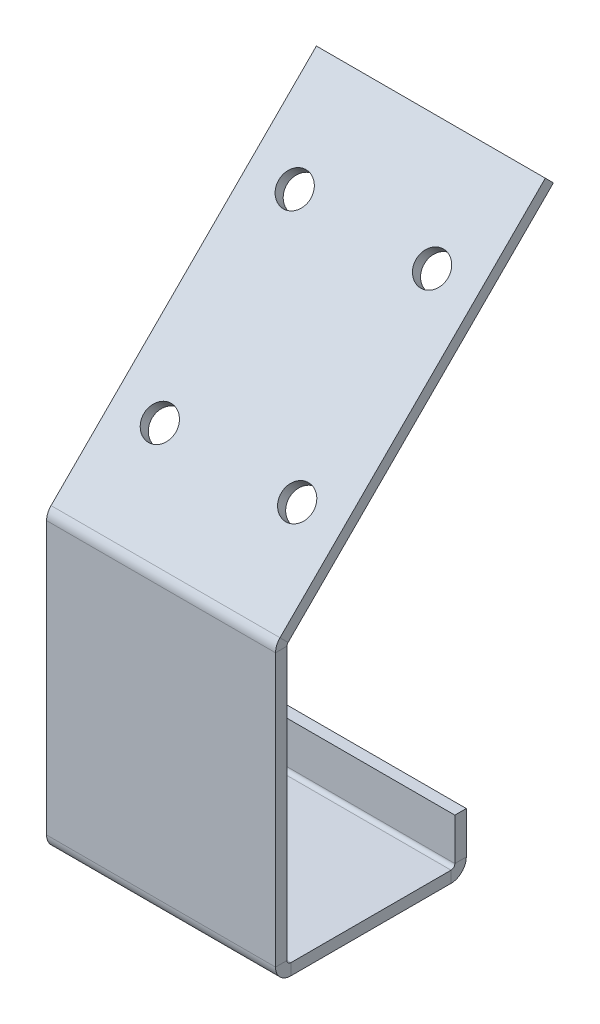
ISO-10303-21;
HEADER;
FILE_DESCRIPTION(('STEP AP214'),'2;1');
FILE_NAME('part.step','',(''),(''),'','','');
FILE_SCHEMA(('AUTOMOTIVE_DESIGN { 1 0 10303 214 1 1 1 1 }'));
ENDSEC;
DATA;
#1=APPLICATION_CONTEXT('core data for automotive mechanical design processes');
#2=APPLICATION_PROTOCOL_DEFINITION('international standard','automotive_design',2000,#1);
#3=PRODUCT_CONTEXT('',#1,'mechanical');
#4=PRODUCT('Part','Part','',(#3));
#5=PRODUCT_RELATED_PRODUCT_CATEGORY('part','',(#4));
#6=PRODUCT_DEFINITION_FORMATION('','',#4);
#7=PRODUCT_DEFINITION_CONTEXT('part definition',#1,'design');
#8=PRODUCT_DEFINITION('design','',#6,#7);
#9=PRODUCT_DEFINITION_SHAPE('','',#8);
#10=(LENGTH_UNIT() NAMED_UNIT(*) SI_UNIT(.MILLI.,.METRE.));
#11=(NAMED_UNIT(*) PLANE_ANGLE_UNIT() SI_UNIT($,.RADIAN.));
#12=(NAMED_UNIT(*) SI_UNIT($,.STERADIAN.) SOLID_ANGLE_UNIT());
#13=UNCERTAINTY_MEASURE_WITH_UNIT(LENGTH_MEASURE(1.E-05),#10,'distance_accuracy_value','');
#14=(GEOMETRIC_REPRESENTATION_CONTEXT(3) GLOBAL_UNCERTAINTY_ASSIGNED_CONTEXT((#13)) GLOBAL_UNIT_ASSIGNED_CONTEXT((#10,
#11,#12)) REPRESENTATION_CONTEXT('',''));
#15=CARTESIAN_POINT('',(0.,0.,0.));
#16=DIRECTION('',(0.,0.,1.));
#17=DIRECTION('',(1.,0.,0.));
#18=AXIS2_PLACEMENT_3D('',#15,#16,#17);
#19=CARTESIAN_POINT('',(-30.,-40.0000000000002,-50.));
#20=DIRECTION('',(1.,0.,0.));
#21=DIRECTION('',(0.,0.,-1.));
#22=AXIS2_PLACEMENT_3D('',#19,#20,#21);
#23=PLANE('',#22);
#24=DIRECTION('',(0.,-1.,0.));
#25=VECTOR('',#24,1.);
#26=CARTESIAN_POINT('',(-30.,-37.0000000000001,-46.));
#27=LINE('',#26,#25);
#28=CARTESIAN_POINT('',(-30.,-37.0000000000001,-46.));
#29=VERTEX_POINT('',#28);
#30=CARTESIAN_POINT('',(-30.,-40.0000000000002,-46.));
#31=VERTEX_POINT('',#30);
#32=EDGE_CURVE('E292',#29,#31,#27,.T.);
#33=ORIENTED_EDGE('',*,*,#32,.T.);
#34=DIRECTION('',(0.,0.,-1.));
#35=VECTOR('',#34,1.);
#36=CARTESIAN_POINT('',(-30.,-40.,1.47775961689587E-13));
#37=LINE('',#36,#35);
#38=CARTESIAN_POINT('',(-30.,-40.,-3.99999999999999));
#39=VERTEX_POINT('',#38);
#40=EDGE_CURVE('E313',#39,#31,#37,.T.);
#41=ORIENTED_EDGE('',*,*,#40,.F.);
#42=DIRECTION('',(0.,1.,0.));
#43=VECTOR('',#42,1.);
#44=CARTESIAN_POINT('',(-30.,-37.,-4.));
#45=LINE('',#44,#43);
#46=CARTESIAN_POINT('',(-30.,-37.,-4.));
#47=VERTEX_POINT('',#46);
#48=EDGE_CURVE('E326',#47,#39,#45,.F.);
#49=ORIENTED_EDGE('',*,*,#48,.F.);
#50=DIRECTION('',(0.,0.,1.));
#51=VECTOR('',#50,1.);
#52=CARTESIAN_POINT('',(-30.,-37.0000000000001,-50.));
#53=LINE('',#52,#51);
#54=EDGE_CURVE('E319',#47,#29,#53,.F.);
#55=ORIENTED_EDGE('',*,*,#54,.T.);
#56=EDGE_LOOP('',(#33,#41,#49,#55));
#57=FACE_BOUND('',#56,.T.);
#58=ADVANCED_FACE('F100',(#57),#23,.F.);
#59=CARTESIAN_POINT('',(30.,-40.,-2.99999999999999));
#60=DIRECTION('',(-1.,0.,0.));
#61=DIRECTION('',(0.,0.,1.));
#62=AXIS2_PLACEMENT_3D('',#59,#60,#61);
#63=PLANE('',#62);
#64=DIRECTION('',(0.,-1.,0.));
#65=VECTOR('',#64,1.);
#66=CARTESIAN_POINT('',(30.,-37.0000000000001,-46.));
#67=LINE('',#66,#65);
#68=CARTESIAN_POINT('',(30.,-37.0000000000001,-46.));
#69=VERTEX_POINT('',#68);
#70=CARTESIAN_POINT('',(30.,-40.0000000000001,-46.));
#71=VERTEX_POINT('',#70);
#72=EDGE_CURVE('E301',#69,#71,#67,.T.);
#73=ORIENTED_EDGE('',*,*,#72,.F.);
#74=DIRECTION('',(0.,0.,-1.));
#75=VECTOR('',#74,1.);
#76=CARTESIAN_POINT('',(30.,-37.,-3.));
#77=LINE('',#76,#75);
#78=CARTESIAN_POINT('',(30.,-37.,-4.));
#79=VERTEX_POINT('',#78);
#80=EDGE_CURVE('E316',#69,#79,#77,.F.);
#81=ORIENTED_EDGE('',*,*,#80,.T.);
#82=DIRECTION('',(0.,1.,0.));
#83=VECTOR('',#82,1.);
#84=CARTESIAN_POINT('',(30.,-40.,-3.99999999999999));
#85=LINE('',#84,#83);
#86=CARTESIAN_POINT('',(30.,-40.,-3.99999999999999));
#87=VERTEX_POINT('',#86);
#88=EDGE_CURVE('E305',#79,#87,#85,.F.);
#89=ORIENTED_EDGE('',*,*,#88,.T.);
#90=DIRECTION('',(0.,0.,1.));
#91=VECTOR('',#90,1.);
#92=CARTESIAN_POINT('',(30.,-40.,1.52205042904847E-13));
#93=LINE('',#92,#91);
#94=EDGE_CURVE('E309',#71,#87,#93,.T.);
#95=ORIENTED_EDGE('',*,*,#94,.F.);
#96=EDGE_LOOP('',(#73,#81,#89,#95));
#97=FACE_BOUND('',#96,.T.);
#98=ADVANCED_FACE('F505',(#97),#63,.F.);
#99=CARTESIAN_POINT('',(0.,-40.,1.52205042904847E-13));
#100=DIRECTION('',(0.,1.,0.));
#101=DIRECTION('',(0.,0.,1.));
#102=AXIS2_PLACEMENT_3D('',#99,#100,#101);
#103=PLANE('',#102);
#104=CARTESIAN_POINT('',(0.,-40.0000000000001,-25.));
#105=DIRECTION('',(0.,-1.,0.));
#106=DIRECTION('',(0.,0.,-1.));
#107=AXIS2_PLACEMENT_3D('',#104,#105,#106);
#108=CIRCLE('',#107,4.2);
#109=CARTESIAN_POINT('',(0.,-40.0000000000001,-29.2));
#110=VERTEX_POINT('',#109);
#111=EDGE_CURVE('E450',#110,#110,#108,.T.);
#112=ORIENTED_EDGE('',*,*,#111,.F.);
#113=EDGE_LOOP('',(#112));
#114=FACE_BOUND('',#113,.T.);
#115=DIRECTION('',(-1.,0.,0.));
#116=VECTOR('',#115,1.);
#117=CARTESIAN_POINT('',(-30.,-40.0000000000002,-46.));
#118=LINE('',#117,#116);
#119=EDGE_CURVE('E226',#31,#71,#118,.F.);
#120=ORIENTED_EDGE('',*,*,#119,.T.);
#121=ORIENTED_EDGE('',*,*,#94,.T.);
#122=DIRECTION('',(-1.,0.,0.));
#123=VECTOR('',#122,1.);
#124=CARTESIAN_POINT('',(30.,-40.,-3.99999999999999));
#125=LINE('',#124,#123);
#126=EDGE_CURVE('E322',#39,#87,#125,.F.);
#127=ORIENTED_EDGE('',*,*,#126,.F.);
#128=ORIENTED_EDGE('',*,*,#40,.T.);
#129=EDGE_LOOP('',(#120,#121,#127,#128));
#130=FACE_BOUND('',#129,.T.);
#131=ADVANCED_FACE('F511',(#114,#130),#103,.F.);
#132=CARTESIAN_POINT('',(0.,-37.,1.41730598888318E-13));
#133=DIRECTION('',(0.,1.,0.));
#134=DIRECTION('',(0.,0.,1.));
#135=AXIS2_PLACEMENT_3D('',#132,#133,#134);
#136=PLANE('',#135);
#137=CARTESIAN_POINT('',(0.,-37.0000000000001,-25.));
#138=DIRECTION('',(0.,1.,0.));
#139=DIRECTION('',(0.,0.,1.));
#140=AXIS2_PLACEMENT_3D('',#137,#138,#139);
#141=CIRCLE('',#140,4.2);
#142=CARTESIAN_POINT('',(0.,-37.,-20.8));
#143=VERTEX_POINT('',#142);
#144=EDGE_CURVE('E287',#143,#143,#141,.T.);
#145=ORIENTED_EDGE('',*,*,#144,.F.);
#146=EDGE_LOOP('',(#145));
#147=FACE_BOUND('',#146,.T.);
#148=ORIENTED_EDGE('',*,*,#80,.F.);
#149=DIRECTION('',(-1.,0.,0.));
#150=VECTOR('',#149,1.);
#151=CARTESIAN_POINT('',(-30.,-37.0000000000001,-46.));
#152=LINE('',#151,#150);
#153=EDGE_CURVE('E118',#29,#69,#152,.F.);
#154=ORIENTED_EDGE('',*,*,#153,.F.);
#155=ORIENTED_EDGE('',*,*,#54,.F.);
#156=DIRECTION('',(-1.,0.,0.));
#157=VECTOR('',#156,1.);
#158=CARTESIAN_POINT('',(30.,-37.,-4.));
#159=LINE('',#158,#157);
#160=EDGE_CURVE('E330',#79,#47,#159,.T.);
#161=ORIENTED_EDGE('',*,*,#160,.F.);
#162=EDGE_LOOP('',(#148,#154,#155,#161));
#163=FACE_BOUND('',#162,.T.);
#164=ADVANCED_FACE('F570',(#147,#163),#136,.T.);
#165=CARTESIAN_POINT('',(0.,0.,-3.));
#166=DIRECTION('',(0.,0.,1.));
#167=DIRECTION('',(1.,0.,0.));
#168=AXIS2_PLACEMENT_3D('',#165,#166,#167);
#169=PLANE('',#168);
#170=DIRECTION('',(-1.,0.,0.));
#171=VECTOR('',#170,1.);
#172=CARTESIAN_POINT('',(-30.,-36.,-3.));
#173=LINE('',#172,#171);
#174=CARTESIAN_POINT('',(-30.,-36.,-3.));
#175=VERTEX_POINT('',#174);
#176=CARTESIAN_POINT('',(30.,-36.,-3.));
#177=VERTEX_POINT('',#176);
#178=EDGE_CURVE('E353',#175,#177,#173,.F.);
#179=ORIENTED_EDGE('',*,*,#178,.F.);
#180=DIRECTION('',(0.,-1.,0.));
#181=VECTOR('',#180,1.);
#182=CARTESIAN_POINT('',(-30.,40.,-3.));
#183=LINE('',#182,#181);
#184=CARTESIAN_POINT('',(-30.,35.3431457505076,-3.));
#185=VERTEX_POINT('',#184);
#186=EDGE_CURVE('E13',#185,#175,#183,.T.);
#187=ORIENTED_EDGE('',*,*,#186,.F.);
#188=DIRECTION('',(1.,0.,0.));
#189=VECTOR('',#188,1.);
#190=CARTESIAN_POINT('',(30.,35.3431457505076,-2.99999999999998));
#191=LINE('',#190,#189);
#192=CARTESIAN_POINT('',(30.,35.3431457505076,-2.99999999999998));
#193=VERTEX_POINT('',#192);
#194=EDGE_CURVE('E426',#193,#185,#191,.F.);
#195=ORIENTED_EDGE('',*,*,#194,.F.);
#196=DIRECTION('',(0.,1.,0.));
#197=VECTOR('',#196,1.);
#198=CARTESIAN_POINT('',(30.,40.,-3.));
#199=LINE('',#198,#197);
#200=EDGE_CURVE('E110',#177,#193,#199,.T.);
#201=ORIENTED_EDGE('',*,*,#200,.F.);
#202=EDGE_LOOP('',(#179,#187,#195,#201));
#203=FACE_BOUND('',#202,.T.);
#204=ADVANCED_FACE('F566',(#203),#169,.F.);
#205=CARTESIAN_POINT('',(0.,0.,0.));
#206=DIRECTION('',(0.,0.,1.));
#207=DIRECTION('',(1.,0.,0.));
#208=AXIS2_PLACEMENT_3D('',#205,#206,#207);
#209=PLANE('',#208);
#210=DIRECTION('',(0.,-1.,0.));
#211=VECTOR('',#210,1.);
#212=CARTESIAN_POINT('',(-30.,40.,0.));
#213=LINE('',#212,#211);
#214=CARTESIAN_POINT('',(-30.,35.3431457505076,0.));
#215=VERTEX_POINT('',#214);
#216=CARTESIAN_POINT('',(-30.,-36.,0.));
#217=VERTEX_POINT('',#216);
#218=EDGE_CURVE('E440',#215,#217,#213,.T.);
#219=ORIENTED_EDGE('',*,*,#218,.T.);
#220=DIRECTION('',(-1.,0.,0.));
#221=VECTOR('',#220,1.);
#222=CARTESIAN_POINT('',(-30.,-36.,0.));
#223=LINE('',#222,#221);
#224=CARTESIAN_POINT('',(30.,-36.,0.));
#225=VERTEX_POINT('',#224);
#226=EDGE_CURVE('E336',#217,#225,#223,.F.);
#227=ORIENTED_EDGE('',*,*,#226,.T.);
#228=DIRECTION('',(0.,1.,0.));
#229=VECTOR('',#228,1.);
#230=CARTESIAN_POINT('',(30.,40.,0.));
#231=LINE('',#230,#229);
#232=CARTESIAN_POINT('',(30.,35.3431457505076,0.));
#233=VERTEX_POINT('',#232);
#234=EDGE_CURVE('E435',#225,#233,#231,.T.);
#235=ORIENTED_EDGE('',*,*,#234,.T.);
#236=DIRECTION('',(1.,0.,0.));
#237=VECTOR('',#236,1.);
#238=CARTESIAN_POINT('',(30.,35.3431457505076,0.));
#239=LINE('',#238,#237);
#240=EDGE_CURVE('E411',#233,#215,#239,.F.);
#241=ORIENTED_EDGE('',*,*,#240,.T.);
#242=EDGE_LOOP('',(#219,#227,#235,#241));
#243=FACE_BOUND('',#242,.T.);
#244=ADVANCED_FACE('F569',(#243),#209,.T.);
#245=CARTESIAN_POINT('',(-30.,40.,-3.));
#246=DIRECTION('',(-1.,0.,0.));
#247=DIRECTION('',(0.,-1.,0.));
#248=AXIS2_PLACEMENT_3D('',#245,#246,#247);
#249=PLANE('',#248);
#250=ORIENTED_EDGE('',*,*,#186,.T.);
#251=DIRECTION('',(0.,0.,1.));
#252=VECTOR('',#251,1.);
#253=CARTESIAN_POINT('',(-30.,-36.,-3.));
#254=LINE('',#253,#252);
#255=EDGE_CURVE('E345',#175,#217,#254,.T.);
#256=ORIENTED_EDGE('',*,*,#255,.T.);
#257=ORIENTED_EDGE('',*,*,#218,.F.);
#258=DIRECTION('',(0.,0.,1.));
#259=VECTOR('',#258,1.);
#260=CARTESIAN_POINT('',(-30.,35.3431457505076,-3.));
#261=LINE('',#260,#259);
#262=EDGE_CURVE('E432',#185,#215,#261,.T.);
#263=ORIENTED_EDGE('',*,*,#262,.F.);
#264=EDGE_LOOP('',(#250,#256,#257,#263));
#265=FACE_BOUND('',#264,.T.);
#266=ADVANCED_FACE('F573',(#265),#249,.T.);
#267=CARTESIAN_POINT('',(30.,40.,-3.));
#268=DIRECTION('',(1.,0.,0.));
#269=DIRECTION('',(0.,1.,0.));
#270=AXIS2_PLACEMENT_3D('',#267,#268,#269);
#271=PLANE('',#270);
#272=DIRECTION('',(0.,0.,1.));
#273=VECTOR('',#272,1.);
#274=CARTESIAN_POINT('',(30.,-36.,-3.));
#275=LINE('',#274,#273);
#276=EDGE_CURVE('E359',#177,#225,#275,.T.);
#277=ORIENTED_EDGE('',*,*,#276,.F.);
#278=ORIENTED_EDGE('',*,*,#200,.T.);
#279=DIRECTION('',(0.,0.,1.));
#280=VECTOR('',#279,1.);
#281=CARTESIAN_POINT('',(30.,35.3431457505076,-2.99999999999998));
#282=LINE('',#281,#280);
#283=EDGE_CURVE('E418',#193,#233,#282,.T.);
#284=ORIENTED_EDGE('',*,*,#283,.T.);
#285=ORIENTED_EDGE('',*,*,#234,.F.);
#286=EDGE_LOOP('',(#277,#278,#284,#285));
#287=FACE_BOUND('',#286,.T.);
#288=ADVANCED_FACE('F102',(#287),#271,.T.);
#289=CARTESIAN_POINT('',(-30.,35.3431457505076,-4.00000000000001));
#290=DIRECTION('',(-1.,0.,0.));
#291=DIRECTION('',(0.,0.,1.));
#292=AXIS2_PLACEMENT_3D('',#289,#290,#291);
#293=PLANE('',#292);
#294=DIRECTION('',(0.,0.707106781186544,0.707106781186551));
#295=VECTOR('',#294,1.);
#296=CARTESIAN_POINT('',(-30.,38.1715728752538,-1.17157287525381));
#297=LINE('',#296,#295);
#298=CARTESIAN_POINT('',(-30.,36.0502525316942,-3.29289321881345));
#299=VERTEX_POINT('',#298);
#300=CARTESIAN_POINT('',(-30.,38.1715728752538,-1.1715728752538));
#301=VERTEX_POINT('',#300);
#302=EDGE_CURVE('E363',#299,#301,#297,.T.);
#303=ORIENTED_EDGE('',*,*,#302,.F.);
#304=CARTESIAN_POINT('',(-30.,35.3431457505076,-4.00000000000001));
#305=DIRECTION('',(1.,0.,0.));
#306=DIRECTION('',(0.,0.,-1.));
#307=AXIS2_PLACEMENT_3D('',#304,#305,#306);
#308=CIRCLE('',#307,1.00000000000001);
#309=EDGE_CURVE('E422',#185,#299,#308,.F.);
#310=ORIENTED_EDGE('',*,*,#309,.F.);
#311=ORIENTED_EDGE('',*,*,#262,.T.);
#312=CARTESIAN_POINT('',(-30.,35.3431457505076,-4.00000000000001));
#313=DIRECTION('',(1.,0.,0.));
#314=DIRECTION('',(0.,0.,-1.));
#315=AXIS2_PLACEMENT_3D('',#312,#313,#314);
#316=CIRCLE('',#315,4.00000000000001);
#317=EDGE_CURVE('E126',#215,#301,#316,.F.);
#318=ORIENTED_EDGE('',*,*,#317,.T.);
#319=EDGE_LOOP('',(#303,#310,#311,#318));
#320=FACE_BOUND('',#319,.T.);
#321=ADVANCED_FACE('F559',(#320),#293,.T.);
#322=CARTESIAN_POINT('',(30.,35.3431457505076,-3.99999999999998));
#323=DIRECTION('',(-1.,0.,0.));
#324=DIRECTION('',(0.,0.,1.));
#325=AXIS2_PLACEMENT_3D('',#322,#323,#324);
#326=PLANE('',#325);
#327=CARTESIAN_POINT('',(30.,35.3431457505076,-3.99999999999998));
#328=DIRECTION('',(1.,0.,0.));
#329=DIRECTION('',(0.,0.,-1.));
#330=AXIS2_PLACEMENT_3D('',#327,#328,#329);
#331=CIRCLE('',#330,1.00000000000001);
#332=CARTESIAN_POINT('',(30.,36.0502525316942,-3.29289321881343));
#333=VERTEX_POINT('',#332);
#334=EDGE_CURVE('E370',#333,#193,#331,.T.);
#335=ORIENTED_EDGE('',*,*,#334,.F.);
#336=DIRECTION('',(0.,0.707106781186544,0.707106781186551));
#337=VECTOR('',#336,1.);
#338=CARTESIAN_POINT('',(30.,36.0502525316942,-3.29289321881344));
#339=LINE('',#338,#337);
#340=CARTESIAN_POINT('',(30.,38.1715728752538,-1.1715728752538));
#341=VERTEX_POINT('',#340);
#342=EDGE_CURVE('E401',#333,#341,#339,.T.);
#343=ORIENTED_EDGE('',*,*,#342,.T.);
#344=CARTESIAN_POINT('',(30.,35.3431457505076,-3.99999999999998));
#345=DIRECTION('',(1.,0.,0.));
#346=DIRECTION('',(0.,0.,-1.));
#347=AXIS2_PLACEMENT_3D('',#344,#345,#346);
#348=CIRCLE('',#347,4.00000000000001);
#349=EDGE_CURVE('E415',#341,#233,#348,.T.);
#350=ORIENTED_EDGE('',*,*,#349,.T.);
#351=ORIENTED_EDGE('',*,*,#283,.F.);
#352=EDGE_LOOP('',(#335,#343,#350,#351));
#353=FACE_BOUND('',#352,.T.);
#354=ADVANCED_FACE('F555',(#353),#326,.F.);
#355=CARTESIAN_POINT('',(30.,35.3431457505076,-3.99999999999998));
#356=DIRECTION('',(1.,0.,0.));
#357=DIRECTION('',(0.,0.707106781186544,0.707106781186551));
#358=AXIS2_PLACEMENT_3D('',#355,#356,#357);
#359=CYLINDRICAL_SURFACE('',#358,4.00000000000001);
#360=ORIENTED_EDGE('',*,*,#240,.F.);
#361=ORIENTED_EDGE('',*,*,#349,.F.);
#362=DIRECTION('',(1.,0.,0.));
#363=VECTOR('',#362,1.);
#364=CARTESIAN_POINT('',(0.,38.1715728752538,-1.1715728752538));
#365=LINE('',#364,#363);
#366=EDGE_CURVE('E397',#301,#341,#365,.T.);
#367=ORIENTED_EDGE('',*,*,#366,.F.);
#368=ORIENTED_EDGE('',*,*,#317,.F.);
#369=EDGE_LOOP('',(#360,#361,#367,#368));
#370=FACE_BOUND('',#369,.T.);
#371=ADVANCED_FACE('F552',(#370),#359,.T.);
#372=CARTESIAN_POINT('',(30.,35.3431457505076,-3.99999999999998));
#373=DIRECTION('',(1.,0.,0.));
#374=DIRECTION('',(0.,0.707106781186544,0.707106781186551));
#375=AXIS2_PLACEMENT_3D('',#372,#373,#374);
#376=CYLINDRICAL_SURFACE('',#375,1.00000000000001);
#377=ORIENTED_EDGE('',*,*,#194,.T.);
#378=ORIENTED_EDGE('',*,*,#309,.T.);
#379=DIRECTION('',(-1.,0.,0.));
#380=VECTOR('',#379,1.);
#381=CARTESIAN_POINT('',(-30.,36.0502525316942,-3.29289321881344));
#382=LINE('',#381,#380);
#383=EDGE_CURVE('E405',#299,#333,#382,.F.);
#384=ORIENTED_EDGE('',*,*,#383,.T.);
#385=ORIENTED_EDGE('',*,*,#334,.T.);
#386=EDGE_LOOP('',(#377,#378,#384,#385));
#387=FACE_BOUND('',#386,.T.);
#388=ADVANCED_FACE('F544',(#387),#376,.F.);
#389=CARTESIAN_POINT('',(30.,37.8786796564403,-0.878679656440346));
#390=DIRECTION('',(1.,0.,0.));
#391=DIRECTION('',(0.,0.,-1.));
#392=AXIS2_PLACEMENT_3D('',#389,#390,#391);
#393=PLANE('',#392);
#394=DIRECTION('',(0.,-0.707106781186551,0.707106781186544));
#395=VECTOR('',#394,1.);
#396=CARTESIAN_POINT('',(30.,37.8786796564403,-0.878679656440346));
#397=LINE('',#396,#395);
#398=CARTESIAN_POINT('',(30.,107.710678118655,-70.7106781186544));
#399=VERTEX_POINT('',#398);
#400=EDGE_CURVE('E375',#399,#341,#397,.T.);
#401=ORIENTED_EDGE('',*,*,#400,.T.);
#402=ORIENTED_EDGE('',*,*,#342,.F.);
#403=DIRECTION('',(0.,0.707106781186551,-0.707106781186544));
#404=VECTOR('',#403,1.);
#405=CARTESIAN_POINT('',(30.,14.2573593128805,18.5));
#406=LINE('',#405,#404);
#407=CARTESIAN_POINT('',(30.,105.589357775095,-72.831998462214));
#408=VERTEX_POINT('',#407);
#409=EDGE_CURVE('E386',#408,#333,#406,.F.);
#410=ORIENTED_EDGE('',*,*,#409,.F.);
#411=DIRECTION('',(0.,-0.707106781186544,-0.707106781186551));
#412=VECTOR('',#411,1.);
#413=CARTESIAN_POINT('',(30.,107.710678118655,-70.7106781186544));
#414=LINE('',#413,#412);
#415=EDGE_CURVE('E367',#399,#408,#414,.T.);
#416=ORIENTED_EDGE('',*,*,#415,.F.);
#417=EDGE_LOOP('',(#401,#402,#410,#416));
#418=FACE_BOUND('',#417,.T.);
#419=ADVANCED_FACE('F541',(#418),#393,.T.);
#420=CARTESIAN_POINT('',(-30.,107.710678118655,-70.7106781186544));
#421=DIRECTION('',(-1.,0.,0.));
#422=DIRECTION('',(0.,-1.,0.));
#423=AXIS2_PLACEMENT_3D('',#420,#421,#422);
#424=PLANE('',#423);
#425=DIRECTION('',(0.,-0.707106781186551,0.707106781186544));
#426=VECTOR('',#425,1.);
#427=CARTESIAN_POINT('',(-30.,14.2573593128805,18.5));
#428=LINE('',#427,#426);
#429=CARTESIAN_POINT('',(-30.,105.589357775095,-72.831998462214));
#430=VERTEX_POINT('',#429);
#431=EDGE_CURVE('E394',#299,#430,#428,.F.);
#432=ORIENTED_EDGE('',*,*,#431,.F.);
#433=ORIENTED_EDGE('',*,*,#302,.T.);
#434=DIRECTION('',(0.,0.707106781186551,-0.707106781186544));
#435=VECTOR('',#434,1.);
#436=CARTESIAN_POINT('',(-30.,107.710678118655,-70.7106781186544));
#437=LINE('',#436,#435);
#438=CARTESIAN_POINT('',(-30.,107.710678118655,-70.7106781186544));
#439=VERTEX_POINT('',#438);
#440=EDGE_CURVE('E383',#301,#439,#437,.T.);
#441=ORIENTED_EDGE('',*,*,#440,.T.);
#442=DIRECTION('',(0.,-0.707106781186544,-0.707106781186551));
#443=VECTOR('',#442,1.);
#444=CARTESIAN_POINT('',(-30.,107.710678118655,-70.7106781186544));
#445=LINE('',#444,#443);
#446=EDGE_CURVE('E371',#439,#430,#445,.T.);
#447=ORIENTED_EDGE('',*,*,#446,.T.);
#448=EDGE_LOOP('',(#432,#433,#441,#447));
#449=FACE_BOUND('',#448,.T.);
#450=ADVANCED_FACE('F537',(#449),#424,.T.);
#451=CARTESIAN_POINT('',(0.,16.3786796564401,20.6213203435596));
#452=DIRECTION('',(0.,0.707106781186544,0.707106781186551));
#453=DIRECTION('',(0.,-0.707106781186551,0.707106781186544));
#454=AXIS2_PLACEMENT_3D('',#451,#452,#453);
#455=PLANE('',#454);
#456=CARTESIAN_POINT('',(-18.,54.6776695296638,-17.6776695296636));
#457=DIRECTION('',(0.,0.707106781186544,0.707106781186551));
#458=DIRECTION('',(0.,-0.707106781186551,0.707106781186544));
#459=AXIS2_PLACEMENT_3D('',#456,#457,#458);
#460=CIRCLE('',#459,4.2);
#461=CARTESIAN_POINT('',(-18.,51.7078210486803,-14.7078210486801));
#462=VERTEX_POINT('',#461);
#463=EDGE_CURVE('E996',#462,#462,#460,.T.);
#464=ORIENTED_EDGE('',*,*,#463,.F.);
#465=EDGE_LOOP('',(#464));
#466=FACE_BOUND('',#465,.T.);
#467=CARTESIAN_POINT('',(18.,54.6776695296638,-17.6776695296636));
#468=DIRECTION('',(0.,0.707106781186544,0.707106781186551));
#469=DIRECTION('',(0.,-0.707106781186551,0.707106781186544));
#470=AXIS2_PLACEMENT_3D('',#467,#468,#469);
#471=CIRCLE('',#470,4.2);
#472=CARTESIAN_POINT('',(18.,51.7078210486803,-14.7078210486801));
#473=VERTEX_POINT('',#472);
#474=EDGE_CURVE('E998',#473,#473,#471,.T.);
#475=ORIENTED_EDGE('',*,*,#474,.F.);
#476=EDGE_LOOP('',(#475));
#477=FACE_BOUND('',#476,.T.);
#478=CARTESIAN_POINT('',(18.,90.0330085889913,-53.0330085889908));
#479=DIRECTION('',(0.,0.707106781186544,0.707106781186551));
#480=DIRECTION('',(0.,-0.707106781186551,0.707106781186544));
#481=AXIS2_PLACEMENT_3D('',#478,#479,#480);
#482=CIRCLE('',#481,4.19999999999999);
#483=CARTESIAN_POINT('',(18.,87.0631601080078,-50.0631601080073));
#484=VERTEX_POINT('',#483);
#485=EDGE_CURVE('E1002',#484,#484,#482,.T.);
#486=ORIENTED_EDGE('',*,*,#485,.F.);
#487=EDGE_LOOP('',(#486));
#488=FACE_BOUND('',#487,.T.);
#489=CARTESIAN_POINT('',(-18.,90.0330085889913,-53.0330085889908));
#490=DIRECTION('',(0.,0.707106781186544,0.707106781186551));
#491=DIRECTION('',(0.,-0.707106781186551,0.707106781186544));
#492=AXIS2_PLACEMENT_3D('',#489,#490,#491);
#493=CIRCLE('',#492,4.19999999999999);
#494=CARTESIAN_POINT('',(-18.,87.0631601080078,-50.0631601080073));
#495=VERTEX_POINT('',#494);
#496=EDGE_CURVE('E456',#495,#495,#493,.T.);
#497=ORIENTED_EDGE('',*,*,#496,.F.);
#498=EDGE_LOOP('',(#497));
#499=FACE_BOUND('',#498,.T.);
#500=ORIENTED_EDGE('',*,*,#440,.F.);
#501=ORIENTED_EDGE('',*,*,#366,.T.);
#502=ORIENTED_EDGE('',*,*,#400,.F.);
#503=DIRECTION('',(1.,0.,0.));
#504=VECTOR('',#503,1.);
#505=CARTESIAN_POINT('',(30.,107.710678118655,-70.7106781186544));
#506=LINE('',#505,#504);
#507=EDGE_CURVE('E379',#439,#399,#506,.T.);
#508=ORIENTED_EDGE('',*,*,#507,.F.);
#509=EDGE_LOOP('',(#500,#501,#502,#508));
#510=FACE_BOUND('',#509,.T.);
#511=ADVANCED_FACE('F533',(#466,#477,#488,#499,#510),#455,.T.);
#512=CARTESIAN_POINT('',(0.,14.2573593128805,18.5));
#513=DIRECTION('',(0.,0.707106781186544,0.707106781186551));
#514=DIRECTION('',(0.,-0.707106781186551,0.707106781186544));
#515=AXIS2_PLACEMENT_3D('',#512,#513,#514);
#516=PLANE('',#515);
#517=CARTESIAN_POINT('',(-18.,52.5563491861041,-19.7989898732233));
#518=DIRECTION('',(0.,0.707106781186544,0.707106781186551));
#519=DIRECTION('',(0.,-0.707106781186551,0.707106781186544));
#520=AXIS2_PLACEMENT_3D('',#517,#518,#519);
#521=CIRCLE('',#520,4.2);
#522=CARTESIAN_POINT('',(-18.,49.5865007051206,-16.8291413922398));
#523=VERTEX_POINT('',#522);
#524=EDGE_CURVE('E104',#523,#523,#521,.T.);
#525=ORIENTED_EDGE('',*,*,#524,.T.);
#526=EDGE_LOOP('',(#525));
#527=FACE_BOUND('',#526,.T.);
#528=CARTESIAN_POINT('',(18.,52.5563491861041,-19.7989898732233));
#529=DIRECTION('',(0.,0.707106781186544,0.707106781186551));
#530=DIRECTION('',(0.,-0.707106781186551,0.707106781186544));
#531=AXIS2_PLACEMENT_3D('',#528,#529,#530);
#532=CIRCLE('',#531,4.2);
#533=CARTESIAN_POINT('',(18.,49.5865007051206,-16.8291413922398));
#534=VERTEX_POINT('',#533);
#535=EDGE_CURVE('E459',#534,#534,#532,.T.);
#536=ORIENTED_EDGE('',*,*,#535,.T.);
#537=EDGE_LOOP('',(#536));
#538=FACE_BOUND('',#537,.T.);
#539=CARTESIAN_POINT('',(18.,87.9116882454317,-55.1543289325504));
#540=DIRECTION('',(0.,0.707106781186544,0.707106781186551));
#541=DIRECTION('',(0.,-0.707106781186551,0.707106781186544));
#542=AXIS2_PLACEMENT_3D('',#539,#540,#541);
#543=CIRCLE('',#542,4.19999999999999);
#544=CARTESIAN_POINT('',(18.,84.9418397644482,-52.184480451567));
#545=VERTEX_POINT('',#544);
#546=EDGE_CURVE('E455',#545,#545,#543,.T.);
#547=ORIENTED_EDGE('',*,*,#546,.T.);
#548=EDGE_LOOP('',(#547));
#549=FACE_BOUND('',#548,.T.);
#550=CARTESIAN_POINT('',(-18.,87.9116882454317,-55.1543289325504));
#551=DIRECTION('',(0.,0.707106781186544,0.707106781186551));
#552=DIRECTION('',(0.,-0.707106781186551,0.707106781186544));
#553=AXIS2_PLACEMENT_3D('',#550,#551,#552);
#554=CIRCLE('',#553,4.19999999999999);
#555=CARTESIAN_POINT('',(-18.,84.9418397644482,-52.184480451567));
#556=VERTEX_POINT('',#555);
#557=EDGE_CURVE('E451',#556,#556,#554,.T.);
#558=ORIENTED_EDGE('',*,*,#557,.T.);
#559=EDGE_LOOP('',(#558));
#560=FACE_BOUND('',#559,.T.);
#561=ORIENTED_EDGE('',*,*,#383,.F.);
#562=ORIENTED_EDGE('',*,*,#431,.T.);
#563=DIRECTION('',(-1.,0.,0.));
#564=VECTOR('',#563,1.);
#565=CARTESIAN_POINT('',(0.,105.589357775095,-72.831998462214));
#566=LINE('',#565,#564);
#567=EDGE_CURVE('E390',#430,#408,#566,.F.);
#568=ORIENTED_EDGE('',*,*,#567,.T.);
#569=ORIENTED_EDGE('',*,*,#409,.T.);
#570=EDGE_LOOP('',(#561,#562,#568,#569));
#571=FACE_BOUND('',#570,.T.);
#572=ADVANCED_FACE('F536',(#527,#538,#549,#560,#571),#516,.F.);
#573=CARTESIAN_POINT('',(30.,107.710678118655,-70.7106781186544));
#574=DIRECTION('',(0.,0.707106781186551,-0.707106781186544));
#575=DIRECTION('',(0.,0.707106781186544,0.707106781186551));
#576=AXIS2_PLACEMENT_3D('',#573,#574,#575);
#577=PLANE('',#576);
#578=ORIENTED_EDGE('',*,*,#567,.F.);
#579=ORIENTED_EDGE('',*,*,#446,.F.);
#580=ORIENTED_EDGE('',*,*,#507,.T.);
#581=ORIENTED_EDGE('',*,*,#415,.T.);
#582=EDGE_LOOP('',(#578,#579,#580,#581));
#583=FACE_BOUND('',#582,.T.);
#584=ADVANCED_FACE('F528',(#583),#577,.T.);
#585=CARTESIAN_POINT('',(30.,-36.,-4.));
#586=DIRECTION('',(1.,0.,0.));
#587=DIRECTION('',(0.,0.,-1.));
#588=AXIS2_PLACEMENT_3D('',#585,#586,#587);
#589=PLANE('',#588);
#590=ORIENTED_EDGE('',*,*,#88,.F.);
#591=CARTESIAN_POINT('',(30.,-36.,-4.));
#592=DIRECTION('',(-1.,0.,0.));
#593=DIRECTION('',(0.,0.,1.));
#594=AXIS2_PLACEMENT_3D('',#591,#592,#593);
#595=CIRCLE('',#594,1.);
#596=EDGE_CURVE('E349',#177,#79,#595,.F.);
#597=ORIENTED_EDGE('',*,*,#596,.F.);
#598=ORIENTED_EDGE('',*,*,#276,.T.);
#599=CARTESIAN_POINT('',(30.,-36.,-4.));
#600=DIRECTION('',(-1.,0.,0.));
#601=DIRECTION('',(0.,0.,1.));
#602=AXIS2_PLACEMENT_3D('',#599,#600,#601);
#603=CIRCLE('',#602,4.);
#604=EDGE_CURVE('E340',#225,#87,#603,.F.);
#605=ORIENTED_EDGE('',*,*,#604,.T.);
#606=EDGE_LOOP('',(#590,#597,#598,#605));
#607=FACE_BOUND('',#606,.T.);
#608=ADVANCED_FACE('F525',(#607),#589,.T.);
#609=CARTESIAN_POINT('',(-30.,-36.,-4.));
#610=DIRECTION('',(1.,0.,0.));
#611=DIRECTION('',(0.,0.,-1.));
#612=AXIS2_PLACEMENT_3D('',#609,#610,#611);
#613=PLANE('',#612);
#614=CARTESIAN_POINT('',(-30.,-36.,-4.));
#615=DIRECTION('',(-1.,0.,0.));
#616=DIRECTION('',(0.,0.,1.));
#617=AXIS2_PLACEMENT_3D('',#614,#615,#616);
#618=CIRCLE('',#617,1.);
#619=EDGE_CURVE('E312',#47,#175,#618,.T.);
#620=ORIENTED_EDGE('',*,*,#619,.F.);
#621=ORIENTED_EDGE('',*,*,#48,.T.);
#622=CARTESIAN_POINT('',(-30.,-36.,-4.));
#623=DIRECTION('',(-1.,0.,0.));
#624=DIRECTION('',(0.,0.,1.));
#625=AXIS2_PLACEMENT_3D('',#622,#623,#624);
#626=CIRCLE('',#625,4.);
#627=EDGE_CURVE('E341',#39,#217,#626,.T.);
#628=ORIENTED_EDGE('',*,*,#627,.T.);
#629=ORIENTED_EDGE('',*,*,#255,.F.);
#630=EDGE_LOOP('',(#620,#621,#628,#629));
#631=FACE_BOUND('',#630,.T.);
#632=ADVANCED_FACE('F520',(#631),#613,.F.);
#633=CARTESIAN_POINT('',(-30.,-36.,-4.));
#634=DIRECTION('',(-1.,0.,0.));
#635=DIRECTION('',(0.,-1.,0.));
#636=AXIS2_PLACEMENT_3D('',#633,#634,#635);
#637=CYLINDRICAL_SURFACE('',#636,4.);
#638=ORIENTED_EDGE('',*,*,#226,.F.);
#639=ORIENTED_EDGE('',*,*,#627,.F.);
#640=ORIENTED_EDGE('',*,*,#126,.T.);
#641=ORIENTED_EDGE('',*,*,#604,.F.);
#642=EDGE_LOOP('',(#638,#639,#640,#641));
#643=FACE_BOUND('',#642,.T.);
#644=ADVANCED_FACE('F516',(#643),#637,.T.);
#645=CARTESIAN_POINT('',(-30.,-36.,-4.));
#646=DIRECTION('',(-1.,0.,0.));
#647=DIRECTION('',(0.,-1.,0.));
#648=AXIS2_PLACEMENT_3D('',#645,#646,#647);
#649=CYLINDRICAL_SURFACE('',#648,1.);
#650=ORIENTED_EDGE('',*,*,#178,.T.);
#651=ORIENTED_EDGE('',*,*,#596,.T.);
#652=ORIENTED_EDGE('',*,*,#160,.T.);
#653=ORIENTED_EDGE('',*,*,#619,.T.);
#654=EDGE_LOOP('',(#650,#651,#652,#653));
#655=FACE_BOUND('',#654,.T.);
#656=ADVANCED_FACE('F519',(#655),#649,.F.);
#657=CARTESIAN_POINT('',(30.,-36.0000000000001,-46.));
#658=DIRECTION('',(1.,0.,0.));
#659=DIRECTION('',(0.,0.,-1.));
#660=AXIS2_PLACEMENT_3D('',#657,#658,#659);
#661=PLANE('',#660);
#662=DIRECTION('',(0.,0.,-1.));
#663=VECTOR('',#662,1.);
#664=CARTESIAN_POINT('',(30.,-36.0000000000001,-50.0000000000001));
#665=LINE('',#664,#663);
#666=CARTESIAN_POINT('',(30.,-36.0000000000001,-47.));
#667=VERTEX_POINT('',#666);
#668=CARTESIAN_POINT('',(30.,-36.0000000000001,-50.));
#669=VERTEX_POINT('',#668);
#670=EDGE_CURVE('E283',#667,#669,#665,.T.);
#671=ORIENTED_EDGE('',*,*,#670,.F.);
#672=CARTESIAN_POINT('',(30.,-36.0000000000001,-46.));
#673=DIRECTION('',(-1.,0.,0.));
#674=DIRECTION('',(0.,0.,1.));
#675=AXIS2_PLACEMENT_3D('',#672,#673,#674);
#676=CIRCLE('',#675,1.);
#677=EDGE_CURVE('E230',#69,#667,#676,.F.);
#678=ORIENTED_EDGE('',*,*,#677,.F.);
#679=ORIENTED_EDGE('',*,*,#72,.T.);
#680=CARTESIAN_POINT('',(30.,-36.0000000000001,-46.));
#681=DIRECTION('',(-1.,0.,0.));
#682=DIRECTION('',(0.,0.,1.));
#683=AXIS2_PLACEMENT_3D('',#680,#681,#682);
#684=CIRCLE('',#683,4.);
#685=EDGE_CURVE('E290',#71,#669,#684,.F.);
#686=ORIENTED_EDGE('',*,*,#685,.T.);
#687=EDGE_LOOP('',(#671,#678,#679,#686));
#688=FACE_BOUND('',#687,.T.);
#689=ADVANCED_FACE('F492',(#688),#661,.T.);
#690=CARTESIAN_POINT('',(-30.,-36.0000000000001,-46.));
#691=DIRECTION('',(1.,0.,0.));
#692=DIRECTION('',(0.,0.,-1.));
#693=AXIS2_PLACEMENT_3D('',#690,#691,#692);
#694=PLANE('',#693);
#695=CARTESIAN_POINT('',(-30.,-36.0000000000001,-46.));
#696=DIRECTION('',(-1.,0.,0.));
#697=DIRECTION('',(0.,0.,1.));
#698=AXIS2_PLACEMENT_3D('',#695,#696,#697);
#699=CIRCLE('',#698,1.);
#700=CARTESIAN_POINT('',(-30.,-36.0000000000001,-47.));
#701=VERTEX_POINT('',#700);
#702=EDGE_CURVE('E237',#701,#29,#699,.T.);
#703=ORIENTED_EDGE('',*,*,#702,.F.);
#704=DIRECTION('',(0.,0.,-1.));
#705=VECTOR('',#704,1.);
#706=CARTESIAN_POINT('',(-30.,-36.0000000000001,-47.));
#707=LINE('',#706,#705);
#708=CARTESIAN_POINT('',(-30.,-36.0000000000001,-50.));
#709=VERTEX_POINT('',#708);
#710=EDGE_CURVE('E234',#701,#709,#707,.T.);
#711=ORIENTED_EDGE('',*,*,#710,.T.);
#712=CARTESIAN_POINT('',(-30.,-36.0000000000001,-46.));
#713=DIRECTION('',(-1.,0.,0.));
#714=DIRECTION('',(0.,0.,1.));
#715=AXIS2_PLACEMENT_3D('',#712,#713,#714);
#716=CIRCLE('',#715,4.);
#717=EDGE_CURVE('E219',#709,#31,#716,.T.);
#718=ORIENTED_EDGE('',*,*,#717,.T.);
#719=ORIENTED_EDGE('',*,*,#32,.F.);
#720=EDGE_LOOP('',(#703,#711,#718,#719));
#721=FACE_BOUND('',#720,.T.);
#722=ADVANCED_FACE('F235',(#721),#694,.F.);
#723=CARTESIAN_POINT('',(-30.,-36.0000000000001,-46.));
#724=DIRECTION('',(-1.,0.,0.));
#725=DIRECTION('',(0.,0.,-1.));
#726=AXIS2_PLACEMENT_3D('',#723,#724,#725);
#727=CYLINDRICAL_SURFACE('',#726,4.);
#728=ORIENTED_EDGE('',*,*,#119,.F.);
#729=ORIENTED_EDGE('',*,*,#717,.F.);
#730=DIRECTION('',(-1.,0.,0.));
#731=VECTOR('',#730,1.);
#732=CARTESIAN_POINT('',(0.,-36.0000000000001,-50.));
#733=LINE('',#732,#731);
#734=EDGE_CURVE('E224',#669,#709,#733,.T.);
#735=ORIENTED_EDGE('',*,*,#734,.F.);
#736=ORIENTED_EDGE('',*,*,#685,.F.);
#737=EDGE_LOOP('',(#728,#729,#735,#736));
#738=FACE_BOUND('',#737,.T.);
#739=ADVANCED_FACE('F221',(#738),#727,.T.);
#740=CARTESIAN_POINT('',(-30.,-36.0000000000001,-46.));
#741=DIRECTION('',(-1.,0.,0.));
#742=DIRECTION('',(0.,0.,-1.));
#743=AXIS2_PLACEMENT_3D('',#740,#741,#742);
#744=CYLINDRICAL_SURFACE('',#743,1.);
#745=ORIENTED_EDGE('',*,*,#153,.T.);
#746=ORIENTED_EDGE('',*,*,#677,.T.);
#747=DIRECTION('',(1.,0.,0.));
#748=VECTOR('',#747,1.);
#749=CARTESIAN_POINT('',(30.,-36.0000000000001,-47.));
#750=LINE('',#749,#748);
#751=EDGE_CURVE('E243',#667,#701,#750,.F.);
#752=ORIENTED_EDGE('',*,*,#751,.T.);
#753=ORIENTED_EDGE('',*,*,#702,.T.);
#754=EDGE_LOOP('',(#745,#746,#752,#753));
#755=FACE_BOUND('',#754,.T.);
#756=ADVANCED_FACE('F494',(#755),#744,.F.);
#757=CARTESIAN_POINT('',(-30.,-37.0000000000001,-50.));
#758=DIRECTION('',(-1.,0.,0.));
#759=DIRECTION('',(0.,0.,1.));
#760=AXIS2_PLACEMENT_3D('',#757,#758,#759);
#761=PLANE('',#760);
#762=DIRECTION('',(0.,-1.,0.));
#763=VECTOR('',#762,1.);
#764=CARTESIAN_POINT('',(-30.,-37.0000000000001,-50.));
#765=LINE('',#764,#763);
#766=CARTESIAN_POINT('',(-30.,-25.0000000000001,-50.));
#767=VERTEX_POINT('',#766);
#768=EDGE_CURVE('E250',#767,#709,#765,.T.);
#769=ORIENTED_EDGE('',*,*,#768,.T.);
#770=ORIENTED_EDGE('',*,*,#710,.F.);
#771=DIRECTION('',(0.,1.,0.));
#772=VECTOR('',#771,1.);
#773=CARTESIAN_POINT('',(-30.,0.,-47.));
#774=LINE('',#773,#772);
#775=CARTESIAN_POINT('',(-30.,-25.0000000000001,-47.));
#776=VERTEX_POINT('',#775);
#777=EDGE_CURVE('E272',#776,#701,#774,.F.);
#778=ORIENTED_EDGE('',*,*,#777,.F.);
#779=DIRECTION('',(0.,0.,1.));
#780=VECTOR('',#779,1.);
#781=CARTESIAN_POINT('',(-30.,-25.0000000000001,-50.));
#782=LINE('',#781,#780);
#783=EDGE_CURVE('E256',#767,#776,#782,.T.);
#784=ORIENTED_EDGE('',*,*,#783,.F.);
#785=EDGE_LOOP('',(#769,#770,#778,#784));
#786=FACE_BOUND('',#785,.T.);
#787=ADVANCED_FACE('F255',(#786),#761,.T.);
#788=CARTESIAN_POINT('',(30.,-25.0000000000001,-50.));
#789=DIRECTION('',(1.,0.,0.));
#790=DIRECTION('',(0.,1.,0.));
#791=AXIS2_PLACEMENT_3D('',#788,#789,#790);
#792=PLANE('',#791);
#793=DIRECTION('',(0.,-1.,0.));
#794=VECTOR('',#793,1.);
#795=CARTESIAN_POINT('',(30.,0.,-47.));
#796=LINE('',#795,#794);
#797=CARTESIAN_POINT('',(30.,-25.0000000000001,-47.));
#798=VERTEX_POINT('',#797);
#799=EDGE_CURVE('E253',#667,#798,#796,.F.);
#800=ORIENTED_EDGE('',*,*,#799,.F.);
#801=ORIENTED_EDGE('',*,*,#670,.T.);
#802=DIRECTION('',(0.,1.,0.));
#803=VECTOR('',#802,1.);
#804=CARTESIAN_POINT('',(30.,-25.0000000000001,-50.));
#805=LINE('',#804,#803);
#806=CARTESIAN_POINT('',(30.,-25.0000000000001,-50.));
#807=VERTEX_POINT('',#806);
#808=EDGE_CURVE('E251',#669,#807,#805,.T.);
#809=ORIENTED_EDGE('',*,*,#808,.T.);
#810=DIRECTION('',(0.,0.,1.));
#811=VECTOR('',#810,1.);
#812=CARTESIAN_POINT('',(30.,-25.0000000000001,-50.));
#813=LINE('',#812,#811);
#814=EDGE_CURVE('E259',#807,#798,#813,.T.);
#815=ORIENTED_EDGE('',*,*,#814,.T.);
#816=EDGE_LOOP('',(#800,#801,#809,#815));
#817=FACE_BOUND('',#816,.T.);
#818=ADVANCED_FACE('F489',(#817),#792,.T.);
#819=CARTESIAN_POINT('',(0.,0.,-50.));
#820=DIRECTION('',(0.,0.,-1.));
#821=DIRECTION('',(-1.,0.,0.));
#822=AXIS2_PLACEMENT_3D('',#819,#820,#821);
#823=PLANE('',#822);
#824=ORIENTED_EDGE('',*,*,#808,.F.);
#825=ORIENTED_EDGE('',*,*,#734,.T.);
#826=ORIENTED_EDGE('',*,*,#768,.F.);
#827=DIRECTION('',(-1.,0.,0.));
#828=VECTOR('',#827,1.);
#829=CARTESIAN_POINT('',(-30.,-25.0000000000001,-50.));
#830=LINE('',#829,#828);
#831=EDGE_CURVE('E260',#807,#767,#830,.T.);
#832=ORIENTED_EDGE('',*,*,#831,.F.);
#833=EDGE_LOOP('',(#824,#825,#826,#832));
#834=FACE_BOUND('',#833,.T.);
#835=ADVANCED_FACE('F248',(#834),#823,.T.);
#836=CARTESIAN_POINT('',(0.,0.,-47.));
#837=DIRECTION('',(0.,0.,-1.));
#838=DIRECTION('',(-1.,0.,0.));
#839=AXIS2_PLACEMENT_3D('',#836,#837,#838);
#840=PLANE('',#839);
#841=ORIENTED_EDGE('',*,*,#751,.F.);
#842=ORIENTED_EDGE('',*,*,#799,.T.);
#843=DIRECTION('',(1.,0.,0.));
#844=VECTOR('',#843,1.);
#845=CARTESIAN_POINT('',(0.,-25.0000000000001,-47.));
#846=LINE('',#845,#844);
#847=EDGE_CURVE('E275',#798,#776,#846,.F.);
#848=ORIENTED_EDGE('',*,*,#847,.T.);
#849=ORIENTED_EDGE('',*,*,#777,.T.);
#850=EDGE_LOOP('',(#841,#842,#848,#849));
#851=FACE_BOUND('',#850,.T.);
#852=ADVANCED_FACE('F486',(#851),#840,.F.);
#853=CARTESIAN_POINT('',(-30.,-25.0000000000001,-50.));
#854=DIRECTION('',(0.,1.,0.));
#855=DIRECTION('',(0.,0.,1.));
#856=AXIS2_PLACEMENT_3D('',#853,#854,#855);
#857=PLANE('',#856);
#858=ORIENTED_EDGE('',*,*,#847,.F.);
#859=ORIENTED_EDGE('',*,*,#814,.F.);
#860=ORIENTED_EDGE('',*,*,#831,.T.);
#861=ORIENTED_EDGE('',*,*,#783,.T.);
#862=EDGE_LOOP('',(#858,#859,#860,#861));
#863=FACE_BOUND('',#862,.T.);
#864=ADVANCED_FACE('F482',(#863),#857,.T.);
#865=CARTESIAN_POINT('',(0.,-30.0000000000001,-25.));
#866=DIRECTION('',(0.,-1.,0.));
#867=DIRECTION('',(0.,0.,-1.));
#868=AXIS2_PLACEMENT_3D('',#865,#866,#867);
#869=CYLINDRICAL_SURFACE('',#868,4.2);
#870=ORIENTED_EDGE('',*,*,#144,.T.);
#871=EDGE_LOOP('',(#870));
#872=FACE_BOUND('',#871,.T.);
#873=ORIENTED_EDGE('',*,*,#111,.T.);
#874=EDGE_LOOP('',(#873));
#875=FACE_BOUND('',#874,.T.);
#876=ADVANCED_FACE('F678',(#872,#875),#869,.F.);
#877=CARTESIAN_POINT('',(-18.,82.9619407771259,-60.1040764008563));
#878=DIRECTION('',(0.,0.707106781186544,0.707106781186551));
#879=DIRECTION('',(0.,-0.707106781186551,0.707106781186544));
#880=AXIS2_PLACEMENT_3D('',#877,#878,#879);
#881=CYLINDRICAL_SURFACE('',#880,4.19999999999999);
#882=ORIENTED_EDGE('',*,*,#496,.T.);
#883=EDGE_LOOP('',(#882));
#884=FACE_BOUND('',#883,.T.);
#885=ORIENTED_EDGE('',*,*,#557,.F.);
#886=EDGE_LOOP('',(#885));
#887=FACE_BOUND('',#886,.T.);
#888=ADVANCED_FACE('F688',(#884,#887),#881,.F.);
#889=CARTESIAN_POINT('',(18.,82.9619407771259,-60.1040764008563));
#890=DIRECTION('',(0.,0.707106781186544,0.707106781186551));
#891=DIRECTION('',(0.,-0.707106781186551,0.707106781186544));
#892=AXIS2_PLACEMENT_3D('',#889,#890,#891);
#893=CYLINDRICAL_SURFACE('',#892,4.19999999999999);
#894=ORIENTED_EDGE('',*,*,#485,.T.);
#895=EDGE_LOOP('',(#894));
#896=FACE_BOUND('',#895,.T.);
#897=ORIENTED_EDGE('',*,*,#546,.F.);
#898=EDGE_LOOP('',(#897));
#899=FACE_BOUND('',#898,.T.);
#900=ADVANCED_FACE('F700',(#896,#899),#893,.F.);
#901=CARTESIAN_POINT('',(18.,47.6066017177983,-24.7487373415291));
#902=DIRECTION('',(0.,0.707106781186544,0.707106781186551));
#903=DIRECTION('',(0.,-0.707106781186551,0.707106781186544));
#904=AXIS2_PLACEMENT_3D('',#901,#902,#903);
#905=CYLINDRICAL_SURFACE('',#904,4.2);
#906=ORIENTED_EDGE('',*,*,#474,.T.);
#907=EDGE_LOOP('',(#906));
#908=FACE_BOUND('',#907,.T.);
#909=ORIENTED_EDGE('',*,*,#535,.F.);
#910=EDGE_LOOP('',(#909));
#911=FACE_BOUND('',#910,.T.);
#912=ADVANCED_FACE('F711',(#908,#911),#905,.F.);
#913=CARTESIAN_POINT('',(-18.,47.6066017177983,-24.7487373415291));
#914=DIRECTION('',(0.,0.707106781186544,0.707106781186551));
#915=DIRECTION('',(0.,-0.707106781186551,0.707106781186544));
#916=AXIS2_PLACEMENT_3D('',#913,#914,#915);
#917=CYLINDRICAL_SURFACE('',#916,4.2);
#918=ORIENTED_EDGE('',*,*,#463,.T.);
#919=EDGE_LOOP('',(#918));
#920=FACE_BOUND('',#919,.T.);
#921=ORIENTED_EDGE('',*,*,#524,.F.);
#922=EDGE_LOOP('',(#921));
#923=FACE_BOUND('',#922,.T.);
#924=ADVANCED_FACE('F721',(#920,#923),#917,.F.);
#925=CLOSED_SHELL('',(#58,#98,#131,#164,#204,#244,#266,#288,#321,#354,#371,#388,#419,#450,#511,
#572,#584,#608,#632,#644,#656,#689,#722,#739,#756,#787,#818,#835,#852,#864,#876,#888,#900,#912,#924));
#926=MANIFOLD_SOLID_BREP('B2',#925);
#927=ADVANCED_BREP_SHAPE_REPRESENTATION('',(#18,#926),#14);
#928=SHAPE_DEFINITION_REPRESENTATION(#9,#927);
ENDSEC;
END-ISO-10303-21;
